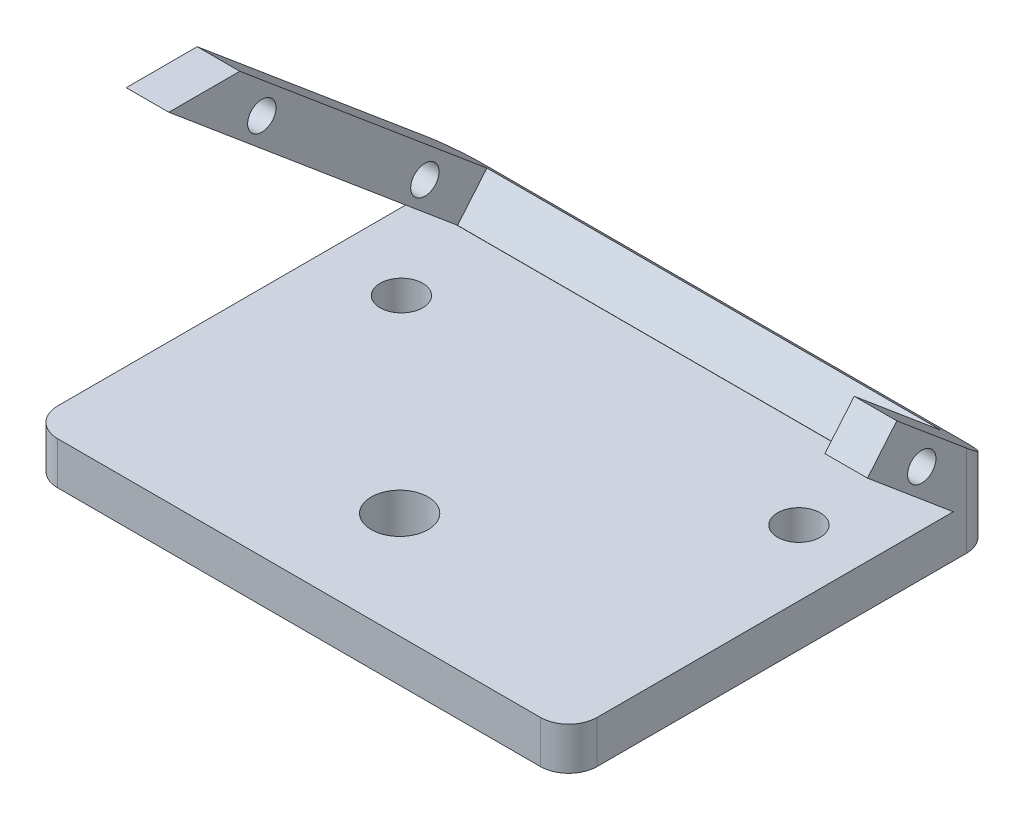
ISO-10303-21;
HEADER;
FILE_DESCRIPTION(('STEP AP214'),'2;1');
FILE_NAME('part.step','',(''),(''),'','','');
FILE_SCHEMA(('AUTOMOTIVE_DESIGN { 1 0 10303 214 1 1 1 1 }'));
ENDSEC;
DATA;
#1=APPLICATION_CONTEXT('core data for automotive mechanical design processes');
#2=APPLICATION_PROTOCOL_DEFINITION('international standard','automotive_design',2000,#1);
#3=PRODUCT_CONTEXT('',#1,'mechanical');
#4=PRODUCT('Part','Part','',(#3));
#5=PRODUCT_RELATED_PRODUCT_CATEGORY('part','',(#4));
#6=PRODUCT_DEFINITION_FORMATION('','',#4);
#7=PRODUCT_DEFINITION_CONTEXT('part definition',#1,'design');
#8=PRODUCT_DEFINITION('design','',#6,#7);
#9=PRODUCT_DEFINITION_SHAPE('','',#8);
#10=(LENGTH_UNIT() NAMED_UNIT(*) SI_UNIT(.MILLI.,.METRE.));
#11=(NAMED_UNIT(*) PLANE_ANGLE_UNIT() SI_UNIT($,.RADIAN.));
#12=(NAMED_UNIT(*) SI_UNIT($,.STERADIAN.) SOLID_ANGLE_UNIT());
#13=UNCERTAINTY_MEASURE_WITH_UNIT(LENGTH_MEASURE(1.E-05),#10,'distance_accuracy_value','');
#14=(GEOMETRIC_REPRESENTATION_CONTEXT(3) GLOBAL_UNCERTAINTY_ASSIGNED_CONTEXT((#13)) GLOBAL_UNIT_ASSIGNED_CONTEXT((#10,
#11,#12)) REPRESENTATION_CONTEXT('',''));
#15=CARTESIAN_POINT('',(0.,0.,0.));
#16=DIRECTION('',(0.,0.,1.));
#17=DIRECTION('',(1.,0.,0.));
#18=AXIS2_PLACEMENT_3D('',#15,#16,#17);
#19=CARTESIAN_POINT('',(10.5591677503251,3.,-3.10813822210472));
#20=DIRECTION('',(0.,-0.766044443118982,0.642787609686535));
#21=DIRECTION('',(0.,-0.642787609686535,-0.766044443118982));
#22=AXIS2_PLACEMENT_3D('',#19,#20,#21);
#23=PLANE('',#22);
#24=DIRECTION('',(-1.,0.,0.));
#25=VECTOR('',#24,1.);
#26=CARTESIAN_POINT('',(7.55916775032511,8.07454859940562,2.93947330203091));
#27=LINE('',#26,#25);
#28=CARTESIAN_POINT('',(10.5591677503251,8.07454859940561,2.93947330203091));
#29=VERTEX_POINT('',#28);
#30=CARTESIAN_POINT('',(7.55916775032511,8.07454859940562,2.93947330203091));
#31=VERTEX_POINT('',#30);
#32=EDGE_CURVE('E158',#29,#31,#27,.T.);
#33=ORIENTED_EDGE('',*,*,#32,.T.);
#34=DIRECTION('',(0.,-0.642787609686535,-0.766044443118982));
#35=VECTOR('',#34,1.);
#36=CARTESIAN_POINT('',(7.55916775032511,2.93224772191335,-3.18888224292093));
#37=LINE('',#36,#35);
#38=CARTESIAN_POINT('',(7.55916775032511,3.,-3.10813822210472));
#39=VERTEX_POINT('',#38);
#40=EDGE_CURVE('E625',#31,#39,#37,.T.);
#41=ORIENTED_EDGE('',*,*,#40,.T.);
#42=DIRECTION('',(-1.,0.,0.));
#43=VECTOR('',#42,1.);
#44=CARTESIAN_POINT('',(10.5591677503251,3.,-3.10813822210472));
#45=LINE('',#44,#43);
#46=CARTESIAN_POINT('',(10.5591677503251,3.,-3.10813822210472));
#47=VERTEX_POINT('',#46);
#48=EDGE_CURVE('E184',#47,#39,#45,.T.);
#49=ORIENTED_EDGE('',*,*,#48,.F.);
#50=DIRECTION('',(0.,0.642787609686535,0.766044443118982));
#51=VECTOR('',#50,1.);
#52=CARTESIAN_POINT('',(10.5591677503251,3.,-3.10813822210472));
#53=LINE('',#52,#51);
#54=EDGE_CURVE('E176',#47,#29,#53,.T.);
#55=ORIENTED_EDGE('',*,*,#54,.T.);
#56=EDGE_LOOP('',(#33,#41,#49,#55));
#57=FACE_BOUND('',#56,.T.);
#58=ADVANCED_FACE('F44',(#57),#23,.T.);
#59=CARTESIAN_POINT('',(-27.4408322496749,20.,-6.02080624187256));
#60=DIRECTION('',(1.,0.,0.));
#61=DIRECTION('',(0.,0.,-1.));
#62=AXIS2_PLACEMENT_3D('',#59,#60,#61);
#63=PLANE('',#62);
#64=CARTESIAN_POINT('',(-27.4408322496749,6.86399658628354,-0.886376682147363));
#65=DIRECTION('',(-1.,0.,0.));
#66=DIRECTION('',(0.,0.,1.));
#67=AXIS2_PLACEMENT_3D('',#64,#65,#66);
#68=CIRCLE('',#67,1.);
#69=CARTESIAN_POINT('',(-27.4408322496749,6.86399658628354,0.113623317852638));
#70=VERTEX_POINT('',#69);
#71=EDGE_CURVE('E666',#70,#70,#68,.T.);
#72=ORIENTED_EDGE('',*,*,#71,.F.);
#73=EDGE_LOOP('',(#72));
#74=FACE_BOUND('',#73,.T.);
#75=CARTESIAN_POINT('',(-27.4408322496749,16.5119082566801,10.5991707754285));
#76=DIRECTION('',(-1.,0.,0.));
#77=DIRECTION('',(0.,0.,1.));
#78=AXIS2_PLACEMENT_3D('',#75,#76,#77);
#79=CIRCLE('',#78,1.00000000000001);
#80=CARTESIAN_POINT('',(-27.4408322496749,16.5119082566801,11.5991707754285));
#81=VERTEX_POINT('',#80);
#82=EDGE_CURVE('E662',#81,#81,#79,.T.);
#83=ORIENTED_EDGE('',*,*,#82,.F.);
#84=EDGE_LOOP('',(#83));
#85=FACE_BOUND('',#84,.T.);
#86=DIRECTION('',(0.,-0.642787609686535,-0.766044443118982));
#87=VECTOR('',#86,1.);
#88=CARTESIAN_POINT('',(-27.4408322496749,20.,12.1516728519971));
#89=LINE('',#88,#87);
#90=CARTESIAN_POINT('',(-27.4408322496749,20.,12.1516728519971));
#91=VERTEX_POINT('',#90);
#92=CARTESIAN_POINT('',(-27.4408322496749,6.42967875711185,-4.02080624187256));
#93=VERTEX_POINT('',#92);
#94=EDGE_CURVE('E192',#91,#93,#89,.T.);
#95=ORIENTED_EDGE('',*,*,#94,.T.);
#96=DIRECTION('',(0.,-1.,0.));
#97=VECTOR('',#96,1.);
#98=CARTESIAN_POINT('',(-27.4408322496749,20.,-4.02080624187256));
#99=LINE('',#98,#97);
#100=CARTESIAN_POINT('',(-27.4408322496749,0.,-4.02080624187256));
#101=VERTEX_POINT('',#100);
#102=EDGE_CURVE('E286',#93,#101,#99,.T.);
#103=ORIENTED_EDGE('',*,*,#102,.T.);
#104=DIRECTION('',(0.,0.,1.));
#105=VECTOR('',#104,1.);
#106=CARTESIAN_POINT('',(-27.4408322496749,0.,-6.02080624187256));
#107=LINE('',#106,#105);
#108=CARTESIAN_POINT('',(-27.4408322496749,0.,21.9791937581274));
#109=VERTEX_POINT('',#108);
#110=EDGE_CURVE('E211',#101,#109,#107,.T.);
#111=ORIENTED_EDGE('',*,*,#110,.T.);
#112=DIRECTION('',(0.,-1.,0.));
#113=VECTOR('',#112,1.);
#114=CARTESIAN_POINT('',(-27.4408322496749,20.,21.9791937581274));
#115=LINE('',#114,#113);
#116=CARTESIAN_POINT('',(-27.4408322496749,3.,21.9791937581274));
#117=VERTEX_POINT('',#116);
#118=EDGE_CURVE('E283',#109,#117,#115,.F.);
#119=ORIENTED_EDGE('',*,*,#118,.T.);
#120=DIRECTION('',(0.,0.,-1.));
#121=VECTOR('',#120,1.);
#122=CARTESIAN_POINT('',(-27.4408322496749,3.,23.9791937581274));
#123=LINE('',#122,#121);
#124=CARTESIAN_POINT('',(-27.4408322496749,3.,-3.10813822210472));
#125=VERTEX_POINT('',#124);
#126=EDGE_CURVE('E196',#117,#125,#123,.T.);
#127=ORIENTED_EDGE('',*,*,#126,.T.);
#128=DIRECTION('',(0.,0.642787609686535,0.766044443118982));
#129=VECTOR('',#128,1.);
#130=CARTESIAN_POINT('',(-27.4408322496749,3.,-3.10813822210472));
#131=LINE('',#130,#129);
#132=CARTESIAN_POINT('',(-27.4408322496749,20.,17.1516728519971));
#133=VERTEX_POINT('',#132);
#134=EDGE_CURVE('E199',#125,#133,#131,.T.);
#135=ORIENTED_EDGE('',*,*,#134,.T.);
#136=DIRECTION('',(0.,0.,1.));
#137=VECTOR('',#136,1.);
#138=CARTESIAN_POINT('',(-27.4408322496749,20.,-6.02080624187256));
#139=LINE('',#138,#137);
#140=EDGE_CURVE('E224',#91,#133,#139,.T.);
#141=ORIENTED_EDGE('',*,*,#140,.F.);
#142=EDGE_LOOP('',(#95,#103,#111,#119,#127,#135,#141));
#143=FACE_BOUND('',#142,.T.);
#144=ADVANCED_FACE('F309',(#74,#85,#143),#63,.F.);
#145=CARTESIAN_POINT('',(-27.4408322496749,20.,23.9791937581274));
#146=DIRECTION('',(0.,0.,-1.));
#147=DIRECTION('',(-1.,0.,0.));
#148=AXIS2_PLACEMENT_3D('',#145,#146,#147);
#149=PLANE('',#148);
#150=DIRECTION('',(1.,0.,0.));
#151=VECTOR('',#150,1.);
#152=CARTESIAN_POINT('',(-27.4408322496749,0.,23.9791937581274));
#153=LINE('',#152,#151);
#154=CARTESIAN_POINT('',(-25.4408322496749,0.,23.9791937581274));
#155=VERTEX_POINT('',#154);
#156=CARTESIAN_POINT('',(8.55916775032511,0.,23.9791937581274));
#157=VERTEX_POINT('',#156);
#158=EDGE_CURVE('E233',#155,#157,#153,.T.);
#159=ORIENTED_EDGE('',*,*,#158,.T.);
#160=DIRECTION('',(0.,-1.,0.));
#161=VECTOR('',#160,1.);
#162=CARTESIAN_POINT('',(8.55916775032511,20.,23.9791937581274));
#163=LINE('',#162,#161);
#164=CARTESIAN_POINT('',(8.5591677503251,3.,23.9791937581274));
#165=VERTEX_POINT('',#164);
#166=EDGE_CURVE('E66',#157,#165,#163,.F.);
#167=ORIENTED_EDGE('',*,*,#166,.T.);
#168=DIRECTION('',(-1.,0.,0.));
#169=VECTOR('',#168,1.);
#170=CARTESIAN_POINT('',(10.5591677503251,3.,23.9791937581274));
#171=LINE('',#170,#169);
#172=CARTESIAN_POINT('',(-25.4408322496749,3.,23.9791937581274));
#173=VERTEX_POINT('',#172);
#174=EDGE_CURVE('E190',#165,#173,#171,.T.);
#175=ORIENTED_EDGE('',*,*,#174,.T.);
#176=DIRECTION('',(0.,-1.,0.));
#177=VECTOR('',#176,1.);
#178=CARTESIAN_POINT('',(-25.4408322496749,20.,23.9791937581274));
#179=LINE('',#178,#177);
#180=EDGE_CURVE('E290',#173,#155,#179,.T.);
#181=ORIENTED_EDGE('',*,*,#180,.T.);
#182=EDGE_LOOP('',(#159,#167,#175,#181));
#183=FACE_BOUND('',#182,.T.);
#184=ADVANCED_FACE('F341',(#183),#149,.F.);
#185=CARTESIAN_POINT('',(10.5591677503251,20.,-6.02080624187256));
#186=DIRECTION('',(-1.,0.,0.));
#187=DIRECTION('',(0.,0.,1.));
#188=AXIS2_PLACEMENT_3D('',#185,#186,#187);
#189=PLANE('',#188);
#190=CARTESIAN_POINT('',(10.5591677503251,6.86399658628354,-0.886376682147369));
#191=DIRECTION('',(-1.,0.,0.));
#192=DIRECTION('',(0.,0.,1.));
#193=AXIS2_PLACEMENT_3D('',#190,#191,#192);
#194=CIRCLE('',#193,1.);
#195=CARTESIAN_POINT('',(10.5591677503251,6.86399658628354,0.113623317852631));
#196=VERTEX_POINT('',#195);
#197=EDGE_CURVE('E247',#196,#196,#194,.T.);
#198=ORIENTED_EDGE('',*,*,#197,.T.);
#199=EDGE_LOOP('',(#198));
#200=FACE_BOUND('',#199,.T.);
#201=DIRECTION('',(0.,0.,-1.));
#202=VECTOR('',#201,1.);
#203=CARTESIAN_POINT('',(10.5591677503251,0.,-6.02080624187256));
#204=LINE('',#203,#202);
#205=CARTESIAN_POINT('',(10.5591677503251,0.,21.9791937581274));
#206=VERTEX_POINT('',#205);
#207=CARTESIAN_POINT('',(10.5591677503251,0.,-4.02080624187256));
#208=VERTEX_POINT('',#207);
#209=EDGE_CURVE('E236',#206,#208,#204,.T.);
#210=ORIENTED_EDGE('',*,*,#209,.T.);
#211=DIRECTION('',(0.,-1.,0.));
#212=VECTOR('',#211,1.);
#213=CARTESIAN_POINT('',(10.5591677503251,20.,-4.02080624187256));
#214=LINE('',#213,#212);
#215=CARTESIAN_POINT('',(10.5591677503251,6.42967875711186,-4.02080624187256));
#216=VERTEX_POINT('',#215);
#217=EDGE_CURVE('E274',#208,#216,#214,.F.);
#218=ORIENTED_EDGE('',*,*,#217,.T.);
#219=DIRECTION('',(0.,-0.642787609686535,-0.766044443118982));
#220=VECTOR('',#219,1.);
#221=CARTESIAN_POINT('',(10.5591677503251,20.,12.1516728519971));
#222=LINE('',#221,#220);
#223=CARTESIAN_POINT('',(10.5591677503251,10.5365679819361,0.873593746198259));
#224=VERTEX_POINT('',#223);
#225=EDGE_CURVE('E178',#224,#216,#222,.T.);
#226=ORIENTED_EDGE('',*,*,#225,.F.);
#227=DIRECTION('',(0.,0.766044443118981,-0.642787609686535));
#228=VECTOR('',#227,1.);
#229=CARTESIAN_POINT('',(10.5591677503251,-25.5795401624432,31.1786067697054));
#230=LINE('',#229,#228);
#231=EDGE_CURVE('E162',#29,#224,#230,.T.);
#232=ORIENTED_EDGE('',*,*,#231,.F.);
#233=ORIENTED_EDGE('',*,*,#54,.F.);
#234=DIRECTION('',(0.,0.,-1.));
#235=VECTOR('',#234,1.);
#236=CARTESIAN_POINT('',(10.5591677503251,3.,23.9791937581274));
#237=LINE('',#236,#235);
#238=CARTESIAN_POINT('',(10.5591677503251,3.,21.9791937581274));
#239=VERTEX_POINT('',#238);
#240=EDGE_CURVE('E186',#239,#47,#237,.T.);
#241=ORIENTED_EDGE('',*,*,#240,.F.);
#242=DIRECTION('',(0.,-1.,0.));
#243=VECTOR('',#242,1.);
#244=CARTESIAN_POINT('',(10.5591677503251,20.,21.9791937581274));
#245=LINE('',#244,#243);
#246=EDGE_CURVE('E270',#239,#206,#245,.T.);
#247=ORIENTED_EDGE('',*,*,#246,.T.);
#248=EDGE_LOOP('',(#210,#218,#226,#232,#233,#241,#247));
#249=FACE_BOUND('',#248,.T.);
#250=ADVANCED_FACE('F174',(#200,#249),#189,.F.);
#251=CARTESIAN_POINT('',(-27.4408322496749,20.,-6.02080624187256));
#252=DIRECTION('',(0.,0.,1.));
#253=DIRECTION('',(1.,0.,0.));
#254=AXIS2_PLACEMENT_3D('',#251,#252,#253);
#255=PLANE('',#254);
#256=DIRECTION('',(-1.,0.,0.));
#257=VECTOR('',#256,1.);
#258=CARTESIAN_POINT('',(10.5591677503251,4.75147949475731,-6.02080624187257));
#259=LINE('',#258,#257);
#260=CARTESIAN_POINT('',(8.5591677503251,4.75147949475731,-6.02080624187257));
#261=VERTEX_POINT('',#260);
#262=CARTESIAN_POINT('',(-25.4408322496749,4.75147949475731,-6.02080624187256));
#263=VERTEX_POINT('',#262);
#264=EDGE_CURVE('E207',#261,#263,#259,.T.);
#265=ORIENTED_EDGE('',*,*,#264,.F.);
#266=DIRECTION('',(0.,-1.,0.));
#267=VECTOR('',#266,1.);
#268=CARTESIAN_POINT('',(8.5591677503251,20.,-6.02080624187256));
#269=LINE('',#268,#267);
#270=CARTESIAN_POINT('',(8.5591677503251,0.,-6.02080624187256));
#271=VERTEX_POINT('',#270);
#272=EDGE_CURVE('E254',#261,#271,#269,.T.);
#273=ORIENTED_EDGE('',*,*,#272,.T.);
#274=DIRECTION('',(-1.,0.,0.));
#275=VECTOR('',#274,1.);
#276=CARTESIAN_POINT('',(-27.4408322496749,0.,-6.02080624187256));
#277=LINE('',#276,#275);
#278=CARTESIAN_POINT('',(-25.4408322496749,0.,-6.02080624187256));
#279=VERTEX_POINT('',#278);
#280=EDGE_CURVE('E229',#271,#279,#277,.T.);
#281=ORIENTED_EDGE('',*,*,#280,.T.);
#282=DIRECTION('',(0.,-1.,0.));
#283=VECTOR('',#282,1.);
#284=CARTESIAN_POINT('',(-25.4408322496749,20.,-6.02080624187256));
#285=LINE('',#284,#283);
#286=EDGE_CURVE('E228',#279,#263,#285,.F.);
#287=ORIENTED_EDGE('',*,*,#286,.T.);
#288=EDGE_LOOP('',(#265,#273,#281,#287));
#289=FACE_BOUND('',#288,.T.);
#290=ADVANCED_FACE('F329',(#289),#255,.F.);
#291=CARTESIAN_POINT('',(0.,20.,0.));
#292=DIRECTION('',(0.,1.,0.));
#293=DIRECTION('',(0.,0.,1.));
#294=AXIS2_PLACEMENT_3D('',#291,#292,#293);
#295=PLANE('',#294);
#296=DIRECTION('',(0.,0.,1.));
#297=VECTOR('',#296,1.);
#298=CARTESIAN_POINT('',(-24.4408322496749,20.,0.));
#299=LINE('',#298,#297);
#300=CARTESIAN_POINT('',(-24.4408322496749,20.,12.1516728519971));
#301=VERTEX_POINT('',#300);
#302=CARTESIAN_POINT('',(-24.4408322496749,20.,17.1516728519971));
#303=VERTEX_POINT('',#302);
#304=EDGE_CURVE('E200',#301,#303,#299,.T.);
#305=ORIENTED_EDGE('',*,*,#304,.F.);
#306=DIRECTION('',(-1.,0.,0.));
#307=VECTOR('',#306,1.);
#308=CARTESIAN_POINT('',(10.5591677503251,20.,12.1516728519971));
#309=LINE('',#308,#307);
#310=EDGE_CURVE('E212',#301,#91,#309,.T.);
#311=ORIENTED_EDGE('',*,*,#310,.T.);
#312=ORIENTED_EDGE('',*,*,#140,.T.);
#313=DIRECTION('',(-1.,0.,0.));
#314=VECTOR('',#313,1.);
#315=CARTESIAN_POINT('',(10.5591677503251,20.,17.1516728519971));
#316=LINE('',#315,#314);
#317=EDGE_CURVE('E215',#303,#133,#316,.T.);
#318=ORIENTED_EDGE('',*,*,#317,.F.);
#319=EDGE_LOOP('',(#305,#311,#312,#318));
#320=FACE_BOUND('',#319,.T.);
#321=ADVANCED_FACE('F312',(#320),#295,.T.);
#322=CARTESIAN_POINT('',(0.,0.,0.));
#323=DIRECTION('',(0.,1.,0.));
#324=DIRECTION('',(0.,0.,1.));
#325=AXIS2_PLACEMENT_3D('',#322,#323,#324);
#326=PLANE('',#325);
#327=CARTESIAN_POINT('',(-22.0690884029042,0.,3.13974413312699));
#328=DIRECTION('',(0.,1.,0.));
#329=DIRECTION('',(0.,0.,1.));
#330=AXIS2_PLACEMENT_3D('',#327,#328,#329);
#331=CIRCLE('',#330,1.5);
#332=CARTESIAN_POINT('',(-22.0690884029042,0.,4.63974413312699));
#333=VERTEX_POINT('',#332);
#334=EDGE_CURVE('E678',#333,#333,#331,.T.);
#335=ORIENTED_EDGE('',*,*,#334,.T.);
#336=EDGE_LOOP('',(#335));
#337=FACE_BOUND('',#336,.T.);
#338=CARTESIAN_POINT('',(5.93091159709576,0.,3.13974413312699));
#339=DIRECTION('',(0.,1.,0.));
#340=DIRECTION('',(0.,0.,1.));
#341=AXIS2_PLACEMENT_3D('',#338,#339,#340);
#342=CIRCLE('',#341,1.5);
#343=CARTESIAN_POINT('',(5.93091159709576,0.,4.63974413312699));
#344=VERTEX_POINT('',#343);
#345=EDGE_CURVE('E682',#344,#344,#342,.T.);
#346=ORIENTED_EDGE('',*,*,#345,.T.);
#347=EDGE_LOOP('',(#346));
#348=FACE_BOUND('',#347,.T.);
#349=CARTESIAN_POINT('',(-8.84513683000358,0.,16.4857821328968));
#350=DIRECTION('',(0.,1.,0.));
#351=DIRECTION('',(0.,0.,1.));
#352=AXIS2_PLACEMENT_3D('',#349,#350,#351);
#353=CIRCLE('',#352,2.);
#354=CARTESIAN_POINT('',(-8.84513683000358,0.,18.4857821328968));
#355=VERTEX_POINT('',#354);
#356=EDGE_CURVE('E667',#355,#355,#353,.T.);
#357=ORIENTED_EDGE('',*,*,#356,.T.);
#358=EDGE_LOOP('',(#357));
#359=FACE_BOUND('',#358,.T.);
#360=ORIENTED_EDGE('',*,*,#280,.F.);
#361=CARTESIAN_POINT('',(8.5591677503251,0.,-4.02080624187256));
#362=DIRECTION('',(0.,1.,0.));
#363=DIRECTION('',(0.,0.,1.));
#364=AXIS2_PLACEMENT_3D('',#361,#362,#363);
#365=CIRCLE('',#364,2.);
#366=EDGE_CURVE('E267',#271,#208,#365,.F.);
#367=ORIENTED_EDGE('',*,*,#366,.T.);
#368=ORIENTED_EDGE('',*,*,#209,.F.);
#369=CARTESIAN_POINT('',(8.5591677503251,0.,21.9791937581274));
#370=DIRECTION('',(0.,1.,0.));
#371=DIRECTION('',(0.,0.,1.));
#372=AXIS2_PLACEMENT_3D('',#369,#370,#371);
#373=CIRCLE('',#372,2.);
#374=EDGE_CURVE('E261',#206,#157,#373,.F.);
#375=ORIENTED_EDGE('',*,*,#374,.T.);
#376=ORIENTED_EDGE('',*,*,#158,.F.);
#377=CARTESIAN_POINT('',(-25.4408322496749,0.,21.9791937581274));
#378=DIRECTION('',(0.,1.,0.));
#379=DIRECTION('',(0.,0.,1.));
#380=AXIS2_PLACEMENT_3D('',#377,#378,#379);
#381=CIRCLE('',#380,2.);
#382=EDGE_CURVE('E258',#155,#109,#381,.F.);
#383=ORIENTED_EDGE('',*,*,#382,.T.);
#384=ORIENTED_EDGE('',*,*,#110,.F.);
#385=CARTESIAN_POINT('',(-25.4408322496749,0.,-4.02080624187256));
#386=DIRECTION('',(0.,1.,0.));
#387=DIRECTION('',(0.,0.,1.));
#388=AXIS2_PLACEMENT_3D('',#385,#386,#387);
#389=CIRCLE('',#388,2.);
#390=EDGE_CURVE('E264',#101,#279,#389,.F.);
#391=ORIENTED_EDGE('',*,*,#390,.T.);
#392=EDGE_LOOP('',(#360,#367,#368,#375,#376,#383,#384,#391));
#393=FACE_BOUND('',#392,.T.);
#394=ADVANCED_FACE('F326',(#337,#348,#359,#393),#326,.F.);
#395=DIRECTION('',(0.,0.642787609686535,0.766044443118982));
#396=VECTOR('',#395,1.);
#397=CARTESIAN_POINT('',(-24.4408322496749,20.,17.1516728519971));
#398=LINE('',#397,#396);
#399=CARTESIAN_POINT('',(-24.4408322496749,3.,-3.10813822210472));
#400=VERTEX_POINT('',#399);
#401=EDGE_CURVE('E640',#400,#303,#398,.T.);
#402=ORIENTED_EDGE('',*,*,#401,.T.);
#403=ORIENTED_EDGE('',*,*,#317,.T.);
#404=ORIENTED_EDGE('',*,*,#134,.F.);
#405=EDGE_CURVE('E221',#400,#125,#45,.T.);
#406=ORIENTED_EDGE('',*,*,#405,.F.);
#407=EDGE_LOOP('',(#402,#403,#404,#406));
#408=FACE_BOUND('',#407,.T.);
#409=ADVANCED_FACE('F305',(#408),#23,.T.);
#410=CARTESIAN_POINT('',(10.5591677503251,3.,23.9791937581274));
#411=DIRECTION('',(0.,1.,0.));
#412=DIRECTION('',(0.,0.,1.));
#413=AXIS2_PLACEMENT_3D('',#410,#411,#412);
#414=PLANE('',#413);
#415=CARTESIAN_POINT('',(-22.0690884029042,3.,3.13974413312699));
#416=DIRECTION('',(0.,1.,0.));
#417=DIRECTION('',(0.,0.,1.));
#418=AXIS2_PLACEMENT_3D('',#415,#416,#417);
#419=CIRCLE('',#418,1.5);
#420=CARTESIAN_POINT('',(-22.0690884029042,3.,4.63974413312699));
#421=VERTEX_POINT('',#420);
#422=EDGE_CURVE('E690',#421,#421,#419,.T.);
#423=ORIENTED_EDGE('',*,*,#422,.F.);
#424=EDGE_LOOP('',(#423));
#425=FACE_BOUND('',#424,.T.);
#426=CARTESIAN_POINT('',(5.93091159709576,3.,3.13974413312699));
#427=DIRECTION('',(0.,1.,0.));
#428=DIRECTION('',(0.,0.,1.));
#429=AXIS2_PLACEMENT_3D('',#426,#427,#428);
#430=CIRCLE('',#429,1.5);
#431=CARTESIAN_POINT('',(5.93091159709576,3.,4.63974413312699));
#432=VERTEX_POINT('',#431);
#433=EDGE_CURVE('E686',#432,#432,#430,.T.);
#434=ORIENTED_EDGE('',*,*,#433,.F.);
#435=EDGE_LOOP('',(#434));
#436=FACE_BOUND('',#435,.T.);
#437=CARTESIAN_POINT('',(-8.84513683000358,3.,16.4857821328968));
#438=DIRECTION('',(0.,1.,0.));
#439=DIRECTION('',(0.,0.,1.));
#440=AXIS2_PLACEMENT_3D('',#437,#438,#439);
#441=CIRCLE('',#440,2.);
#442=CARTESIAN_POINT('',(-8.84513683000358,3.,18.4857821328968));
#443=VERTEX_POINT('',#442);
#444=EDGE_CURVE('E674',#443,#443,#441,.T.);
#445=ORIENTED_EDGE('',*,*,#444,.F.);
#446=EDGE_LOOP('',(#445));
#447=FACE_BOUND('',#446,.T.);
#448=ORIENTED_EDGE('',*,*,#174,.F.);
#449=CARTESIAN_POINT('',(8.5591677503251,3.,21.9791937581274));
#450=DIRECTION('',(0.,1.,0.));
#451=DIRECTION('',(0.,0.,1.));
#452=AXIS2_PLACEMENT_3D('',#449,#450,#451);
#453=CIRCLE('',#452,2.);
#454=EDGE_CURVE('E12',#165,#239,#453,.T.);
#455=ORIENTED_EDGE('',*,*,#454,.T.);
#456=ORIENTED_EDGE('',*,*,#240,.T.);
#457=ORIENTED_EDGE('',*,*,#48,.T.);
#458=EDGE_CURVE('E220',#39,#400,#45,.T.);
#459=ORIENTED_EDGE('',*,*,#458,.T.);
#460=ORIENTED_EDGE('',*,*,#405,.T.);
#461=ORIENTED_EDGE('',*,*,#126,.F.);
#462=CARTESIAN_POINT('',(-25.4408322496749,3.,21.9791937581274));
#463=DIRECTION('',(0.,1.,0.));
#464=DIRECTION('',(0.,0.,1.));
#465=AXIS2_PLACEMENT_3D('',#462,#463,#464);
#466=CIRCLE('',#465,2.);
#467=EDGE_CURVE('E53',#117,#173,#466,.T.);
#468=ORIENTED_EDGE('',*,*,#467,.T.);
#469=EDGE_LOOP('',(#448,#455,#456,#457,#459,#460,#461,#468));
#470=FACE_BOUND('',#469,.T.);
#471=ADVANCED_FACE('F302',(#425,#436,#447,#470),#414,.T.);
#472=CARTESIAN_POINT('',(10.5591677503251,20.,12.1516728519971));
#473=DIRECTION('',(0.,0.766044443118981,-0.642787609686535));
#474=DIRECTION('',(0.,0.642787609686535,0.766044443118982));
#475=AXIS2_PLACEMENT_3D('',#472,#473,#474);
#476=PLANE('',#475);
#477=ORIENTED_EDGE('',*,*,#225,.T.);
#478=CARTESIAN_POINT('',(8.5591677503251,6.42967875711186,-4.02080624187256));
#479=DIRECTION('',(0.,0.766044443118981,-0.642787609686535));
#480=DIRECTION('',(0.,-0.642787609686535,-0.766044443118982));
#481=AXIS2_PLACEMENT_3D('',#478,#479,#480);
#482=ELLIPSE('',#481,2.61081457866455,2.);
#483=EDGE_CURVE('E280',#216,#261,#482,.T.);
#484=ORIENTED_EDGE('',*,*,#483,.T.);
#485=ORIENTED_EDGE('',*,*,#264,.T.);
#486=CARTESIAN_POINT('',(-25.4408322496749,6.42967875711186,-4.02080624187256));
#487=DIRECTION('',(0.,0.766044443118981,-0.642787609686535));
#488=DIRECTION('',(0.,-0.642787609686535,-0.766044443118982));
#489=AXIS2_PLACEMENT_3D('',#486,#487,#488);
#490=ELLIPSE('',#489,2.61081457866455,2.);
#491=EDGE_CURVE('E277',#263,#93,#490,.T.);
#492=ORIENTED_EDGE('',*,*,#491,.T.);
#493=ORIENTED_EDGE('',*,*,#94,.F.);
#494=ORIENTED_EDGE('',*,*,#310,.F.);
#495=DIRECTION('',(0.,0.642787609686536,0.766044443118981));
#496=VECTOR('',#495,1.);
#497=CARTESIAN_POINT('',(-24.4408322496749,22.4620193825305,15.0857932961644));
#498=LINE('',#497,#496);
#499=CARTESIAN_POINT('',(-24.4408322496749,5.39426710444385,-5.25476179875358));
#500=VERTEX_POINT('',#499);
#501=EDGE_CURVE('E180',#500,#301,#498,.T.);
#502=ORIENTED_EDGE('',*,*,#501,.F.);
#503=DIRECTION('',(-1.,0.,0.));
#504=VECTOR('',#503,1.);
#505=CARTESIAN_POINT('',(-24.4408322496749,5.39426710444385,-5.25476179875359));
#506=LINE('',#505,#504);
#507=CARTESIAN_POINT('',(7.55916775032511,5.39426710444385,-5.25476179875359));
#508=VERTEX_POINT('',#507);
#509=EDGE_CURVE('E654',#508,#500,#506,.T.);
#510=ORIENTED_EDGE('',*,*,#509,.F.);
#511=DIRECTION('',(0.,-0.642787609686536,-0.766044443118981));
#512=VECTOR('',#511,1.);
#513=CARTESIAN_POINT('',(7.55916775032511,5.39426710444385,-5.25476179875359));
#514=LINE('',#513,#512);
#515=CARTESIAN_POINT('',(7.55916775032511,10.5365679819361,0.873593746198259));
#516=VERTEX_POINT('',#515);
#517=EDGE_CURVE('E651',#516,#508,#514,.T.);
#518=ORIENTED_EDGE('',*,*,#517,.F.);
#519=DIRECTION('',(-1.,0.,0.));
#520=VECTOR('',#519,1.);
#521=CARTESIAN_POINT('',(7.55916775032511,10.5365679819361,0.873593746198259));
#522=LINE('',#521,#520);
#523=EDGE_CURVE('E648',#224,#516,#522,.T.);
#524=ORIENTED_EDGE('',*,*,#523,.F.);
#525=EDGE_LOOP('',(#477,#484,#485,#492,#493,#494,#502,#510,#518,#524));
#526=FACE_BOUND('',#525,.T.);
#527=ADVANCED_FACE('F317',(#526),#476,.T.);
#528=CARTESIAN_POINT('',(10.5591677503251,3.,-3.10813822210472));
#529=DIRECTION('',(0.,-0.766044443118982,0.642787609686535));
#530=DIRECTION('',(0.,-0.642787609686535,-0.766044443118982));
#531=AXIS2_PLACEMENT_3D('',#528,#529,#530);
#532=PLANE('',#531);
#533=ORIENTED_EDGE('',*,*,#458,.F.);
#534=CARTESIAN_POINT('',(7.55916775032511,2.93224772191333,-3.18888224292094));
#535=VERTEX_POINT('',#534);
#536=EDGE_CURVE('E620',#39,#535,#37,.T.);
#537=ORIENTED_EDGE('',*,*,#536,.T.);
#538=DIRECTION('',(-1.,0.,0.));
#539=VECTOR('',#538,1.);
#540=CARTESIAN_POINT('',(-24.4408322496749,2.93224772191334,-3.18888224292094));
#541=LINE('',#540,#539);
#542=CARTESIAN_POINT('',(-24.4408322496749,2.93224772191334,-3.18888224292094));
#543=VERTEX_POINT('',#542);
#544=EDGE_CURVE('E632',#535,#543,#541,.T.);
#545=ORIENTED_EDGE('',*,*,#544,.T.);
#546=EDGE_CURVE('E622',#543,#400,#398,.T.);
#547=ORIENTED_EDGE('',*,*,#546,.T.);
#548=EDGE_LOOP('',(#533,#537,#545,#547));
#549=FACE_BOUND('',#548,.T.);
#550=ADVANCED_FACE('F506',(#549),#532,.F.);
#551=CARTESIAN_POINT('',(7.55916775032511,-25.5795401624432,31.1786067697054));
#552=DIRECTION('',(0.,-0.642787609686535,-0.766044443118981));
#553=DIRECTION('',(0.,0.766044443118981,-0.642787609686535));
#554=AXIS2_PLACEMENT_3D('',#551,#552,#553);
#555=PLANE('',#554);
#556=ORIENTED_EDGE('',*,*,#231,.T.);
#557=ORIENTED_EDGE('',*,*,#523,.T.);
#558=DIRECTION('',(0.,0.766044443118981,-0.642787609686535));
#559=VECTOR('',#558,1.);
#560=CARTESIAN_POINT('',(7.55916775032511,-25.5795401624432,31.1786067697054));
#561=LINE('',#560,#559);
#562=EDGE_CURVE('E164',#31,#516,#561,.T.);
#563=ORIENTED_EDGE('',*,*,#562,.F.);
#564=ORIENTED_EDGE('',*,*,#32,.F.);
#565=EDGE_LOOP('',(#556,#557,#563,#564));
#566=FACE_BOUND('',#565,.T.);
#567=ADVANCED_FACE('F160',(#566),#555,.F.);
#568=CARTESIAN_POINT('',(7.55916775032511,-30.7218410399355,25.0502512247535));
#569=DIRECTION('',(1.,0.,0.));
#570=DIRECTION('',(0.,0.,-1.));
#571=AXIS2_PLACEMENT_3D('',#568,#569,#570);
#572=PLANE('',#571);
#573=CARTESIAN_POINT('',(7.55916775032511,6.86399658628354,-0.886376682147369));
#574=DIRECTION('',(1.,0.,0.));
#575=DIRECTION('',(0.,0.,-1.));
#576=AXIS2_PLACEMENT_3D('',#573,#574,#575);
#577=CIRCLE('',#576,1.);
#578=CARTESIAN_POINT('',(7.55916775032511,6.86399658628354,-1.88637668214737));
#579=VERTEX_POINT('',#578);
#580=EDGE_CURVE('E251',#579,#579,#577,.T.);
#581=ORIENTED_EDGE('',*,*,#580,.T.);
#582=EDGE_LOOP('',(#581));
#583=FACE_BOUND('',#582,.T.);
#584=ORIENTED_EDGE('',*,*,#562,.T.);
#585=ORIENTED_EDGE('',*,*,#517,.T.);
#586=DIRECTION('',(0.,0.766044443118981,-0.642787609686535));
#587=VECTOR('',#586,1.);
#588=CARTESIAN_POINT('',(7.55916775032511,-30.7218410399355,25.0502512247535));
#589=LINE('',#588,#587);
#590=EDGE_CURVE('E627',#535,#508,#589,.T.);
#591=ORIENTED_EDGE('',*,*,#590,.F.);
#592=ORIENTED_EDGE('',*,*,#536,.F.);
#593=ORIENTED_EDGE('',*,*,#40,.F.);
#594=EDGE_LOOP('',(#584,#585,#591,#592,#593));
#595=FACE_BOUND('',#594,.T.);
#596=ADVANCED_FACE('F487',(#583,#595),#572,.F.);
#597=CARTESIAN_POINT('',(-24.4408322496749,-30.7218410399355,25.0502512247535));
#598=DIRECTION('',(0.,-0.642787609686535,-0.766044443118981));
#599=DIRECTION('',(0.,0.766044443118981,-0.642787609686535));
#600=AXIS2_PLACEMENT_3D('',#597,#598,#599);
#601=PLANE('',#600);
#602=ORIENTED_EDGE('',*,*,#590,.T.);
#603=ORIENTED_EDGE('',*,*,#509,.T.);
#604=DIRECTION('',(0.,0.766044443118981,-0.642787609686535));
#605=VECTOR('',#604,1.);
#606=CARTESIAN_POINT('',(-24.4408322496749,-30.7218410399355,25.0502512247535));
#607=LINE('',#606,#605);
#608=EDGE_CURVE('E637',#543,#500,#607,.T.);
#609=ORIENTED_EDGE('',*,*,#608,.F.);
#610=ORIENTED_EDGE('',*,*,#544,.F.);
#611=EDGE_LOOP('',(#602,#603,#609,#610));
#612=FACE_BOUND('',#611,.T.);
#613=ADVANCED_FACE('F477',(#612),#601,.F.);
#614=CARTESIAN_POINT('',(-24.4408322496749,-13.6540887618488,45.3908063196715));
#615=DIRECTION('',(-1.,0.,0.));
#616=DIRECTION('',(0.,0.,1.));
#617=AXIS2_PLACEMENT_3D('',#614,#615,#616);
#618=PLANE('',#617);
#619=CARTESIAN_POINT('',(-24.4408322496749,6.86399658628354,-0.886376682147363));
#620=DIRECTION('',(-1.,0.,0.));
#621=DIRECTION('',(0.,0.,1.));
#622=AXIS2_PLACEMENT_3D('',#619,#620,#621);
#623=CIRCLE('',#622,1.);
#624=CARTESIAN_POINT('',(-24.4408322496749,6.86399658628354,0.113623317852637));
#625=VERTEX_POINT('',#624);
#626=EDGE_CURVE('E246',#625,#625,#623,.T.);
#627=ORIENTED_EDGE('',*,*,#626,.T.);
#628=EDGE_LOOP('',(#627));
#629=FACE_BOUND('',#628,.T.);
#630=CARTESIAN_POINT('',(-24.4408322496749,16.5119082566801,10.5991707754285));
#631=DIRECTION('',(-1.,0.,0.));
#632=DIRECTION('',(0.,0.,1.));
#633=AXIS2_PLACEMENT_3D('',#630,#631,#632);
#634=CIRCLE('',#633,1.00000000000001);
#635=CARTESIAN_POINT('',(-24.4408322496749,16.5119082566801,11.5991707754285));
#636=VERTEX_POINT('',#635);
#637=EDGE_CURVE('E242',#636,#636,#634,.T.);
#638=ORIENTED_EDGE('',*,*,#637,.T.);
#639=EDGE_LOOP('',(#638));
#640=FACE_BOUND('',#639,.T.);
#641=ORIENTED_EDGE('',*,*,#304,.T.);
#642=ORIENTED_EDGE('',*,*,#401,.F.);
#643=ORIENTED_EDGE('',*,*,#546,.F.);
#644=ORIENTED_EDGE('',*,*,#608,.T.);
#645=ORIENTED_EDGE('',*,*,#501,.T.);
#646=EDGE_LOOP('',(#641,#642,#643,#644,#645));
#647=FACE_BOUND('',#646,.T.);
#648=ADVANCED_FACE('F467',(#629,#640,#647),#618,.F.);
#649=CARTESIAN_POINT('',(10.5591677503251,16.5119082566801,10.5991707754285));
#650=DIRECTION('',(-1.,0.,0.));
#651=DIRECTION('',(0.,0.,1.));
#652=AXIS2_PLACEMENT_3D('',#649,#650,#651);
#653=CYLINDRICAL_SURFACE('',#652,1.00000000000001);
#654=ORIENTED_EDGE('',*,*,#82,.T.);
#655=EDGE_LOOP('',(#654));
#656=FACE_BOUND('',#655,.T.);
#657=ORIENTED_EDGE('',*,*,#637,.F.);
#658=EDGE_LOOP('',(#657));
#659=FACE_BOUND('',#658,.T.);
#660=ADVANCED_FACE('F458',(#656,#659),#653,.F.);
#661=CARTESIAN_POINT('',(10.5591677503251,6.86399658628354,-0.886376682147369));
#662=DIRECTION('',(-1.,0.,0.));
#663=DIRECTION('',(0.,0.,1.));
#664=AXIS2_PLACEMENT_3D('',#661,#662,#663);
#665=CYLINDRICAL_SURFACE('',#664,1.);
#666=ORIENTED_EDGE('',*,*,#71,.T.);
#667=EDGE_LOOP('',(#666));
#668=FACE_BOUND('',#667,.T.);
#669=ORIENTED_EDGE('',*,*,#626,.F.);
#670=EDGE_LOOP('',(#669));
#671=FACE_BOUND('',#670,.T.);
#672=ADVANCED_FACE('F448',(#668,#671),#665,.F.);
#673=ORIENTED_EDGE('',*,*,#197,.F.);
#674=EDGE_LOOP('',(#673));
#675=FACE_BOUND('',#674,.T.);
#676=ORIENTED_EDGE('',*,*,#580,.F.);
#677=EDGE_LOOP('',(#676));
#678=FACE_BOUND('',#677,.T.);
#679=ADVANCED_FACE('F438',(#675,#678),#665,.F.);
#680=CARTESIAN_POINT('',(-8.84513683000358,0.,16.4857821328968));
#681=DIRECTION('',(0.,1.,0.));
#682=DIRECTION('',(0.,0.,1.));
#683=AXIS2_PLACEMENT_3D('',#680,#681,#682);
#684=CYLINDRICAL_SURFACE('',#683,2.);
#685=ORIENTED_EDGE('',*,*,#356,.F.);
#686=EDGE_LOOP('',(#685));
#687=FACE_BOUND('',#686,.T.);
#688=ORIENTED_EDGE('',*,*,#444,.T.);
#689=EDGE_LOOP('',(#688));
#690=FACE_BOUND('',#689,.T.);
#691=ADVANCED_FACE('F428',(#687,#690),#684,.F.);
#692=CARTESIAN_POINT('',(5.93091159709576,0.,3.13974413312699));
#693=DIRECTION('',(0.,1.,0.));
#694=DIRECTION('',(0.,0.,1.));
#695=AXIS2_PLACEMENT_3D('',#692,#693,#694);
#696=CYLINDRICAL_SURFACE('',#695,1.5);
#697=ORIENTED_EDGE('',*,*,#345,.F.);
#698=EDGE_LOOP('',(#697));
#699=FACE_BOUND('',#698,.T.);
#700=ORIENTED_EDGE('',*,*,#433,.T.);
#701=EDGE_LOOP('',(#700));
#702=FACE_BOUND('',#701,.T.);
#703=ADVANCED_FACE('F418',(#699,#702),#696,.F.);
#704=CARTESIAN_POINT('',(-22.0690884029042,0.,3.13974413312699));
#705=DIRECTION('',(0.,1.,0.));
#706=DIRECTION('',(0.,0.,1.));
#707=AXIS2_PLACEMENT_3D('',#704,#705,#706);
#708=CYLINDRICAL_SURFACE('',#707,1.5);
#709=ORIENTED_EDGE('',*,*,#334,.F.);
#710=EDGE_LOOP('',(#709));
#711=FACE_BOUND('',#710,.T.);
#712=ORIENTED_EDGE('',*,*,#422,.T.);
#713=EDGE_LOOP('',(#712));
#714=FACE_BOUND('',#713,.T.);
#715=ADVANCED_FACE('F382',(#711,#714),#708,.F.);
#716=CARTESIAN_POINT('',(8.5591677503251,20.,-4.02080624187256));
#717=DIRECTION('',(0.,-1.,0.));
#718=DIRECTION('',(0.,0.,-1.));
#719=AXIS2_PLACEMENT_3D('',#716,#717,#718);
#720=CYLINDRICAL_SURFACE('',#719,2.);
#721=ORIENTED_EDGE('',*,*,#483,.F.);
#722=ORIENTED_EDGE('',*,*,#217,.F.);
#723=ORIENTED_EDGE('',*,*,#366,.F.);
#724=ORIENTED_EDGE('',*,*,#272,.F.);
#725=EDGE_LOOP('',(#721,#722,#723,#724));
#726=FACE_BOUND('',#725,.T.);
#727=ADVANCED_FACE('F333',(#726),#720,.T.);
#728=CARTESIAN_POINT('',(-25.4408322496749,20.,-4.02080624187256));
#729=DIRECTION('',(0.,-1.,0.));
#730=DIRECTION('',(0.,0.,-1.));
#731=AXIS2_PLACEMENT_3D('',#728,#729,#730);
#732=CYLINDRICAL_SURFACE('',#731,2.);
#733=ORIENTED_EDGE('',*,*,#491,.F.);
#734=ORIENTED_EDGE('',*,*,#286,.F.);
#735=ORIENTED_EDGE('',*,*,#390,.F.);
#736=ORIENTED_EDGE('',*,*,#102,.F.);
#737=EDGE_LOOP('',(#733,#734,#735,#736));
#738=FACE_BOUND('',#737,.T.);
#739=ADVANCED_FACE('F322',(#738),#732,.T.);
#740=CARTESIAN_POINT('',(8.5591677503251,20.,21.9791937581274));
#741=DIRECTION('',(0.,-1.,0.));
#742=DIRECTION('',(0.,0.,-1.));
#743=AXIS2_PLACEMENT_3D('',#740,#741,#742);
#744=CYLINDRICAL_SURFACE('',#743,2.);
#745=ORIENTED_EDGE('',*,*,#454,.F.);
#746=ORIENTED_EDGE('',*,*,#166,.F.);
#747=ORIENTED_EDGE('',*,*,#374,.F.);
#748=ORIENTED_EDGE('',*,*,#246,.F.);
#749=EDGE_LOOP('',(#745,#746,#747,#748));
#750=FACE_BOUND('',#749,.T.);
#751=ADVANCED_FACE('F339',(#750),#744,.T.);
#752=CARTESIAN_POINT('',(-25.4408322496749,20.,21.9791937581274));
#753=DIRECTION('',(0.,-1.,0.));
#754=DIRECTION('',(0.,0.,-1.));
#755=AXIS2_PLACEMENT_3D('',#752,#753,#754);
#756=CYLINDRICAL_SURFACE('',#755,2.);
#757=ORIENTED_EDGE('',*,*,#467,.F.);
#758=ORIENTED_EDGE('',*,*,#118,.F.);
#759=ORIENTED_EDGE('',*,*,#382,.F.);
#760=ORIENTED_EDGE('',*,*,#180,.F.);
#761=EDGE_LOOP('',(#757,#758,#759,#760));
#762=FACE_BOUND('',#761,.T.);
#763=ADVANCED_FACE('F46',(#762),#756,.T.);
#764=CLOSED_SHELL('',(#58,#144,#184,#250,#290,#321,#394,#409,#471,#527,#550,#567,#596,#613,#648,
#660,#672,#679,#691,#703,#715,#727,#739,#751,#763));
#765=MANIFOLD_SOLID_BREP('B2',#764);
#766=ADVANCED_BREP_SHAPE_REPRESENTATION('',(#18,#765),#14);
#767=SHAPE_DEFINITION_REPRESENTATION(#9,#766);
ENDSEC;
END-ISO-10303-21;
